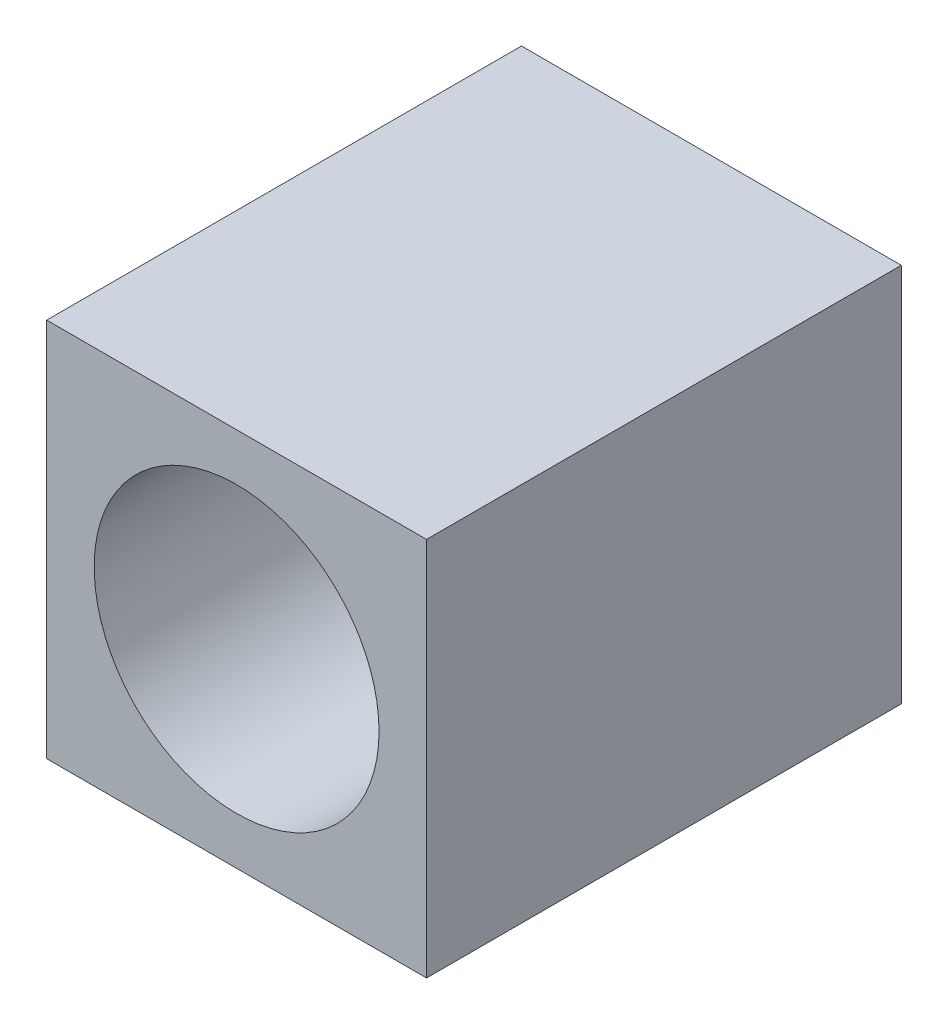
ISO-10303-21;
HEADER;
FILE_DESCRIPTION(('STEP AP214'),'2;1');
FILE_NAME('part.step','',(''),(''),'','','');
FILE_SCHEMA(('AUTOMOTIVE_DESIGN { 1 0 10303 214 1 1 1 1 }'));
ENDSEC;
DATA;
#1=APPLICATION_CONTEXT('core data for automotive mechanical design processes');
#2=APPLICATION_PROTOCOL_DEFINITION('international standard','automotive_design',2000,#1);
#3=PRODUCT_CONTEXT('',#1,'mechanical');
#4=PRODUCT('Part','Part','',(#3));
#5=PRODUCT_RELATED_PRODUCT_CATEGORY('part','',(#4));
#6=PRODUCT_DEFINITION_FORMATION('','',#4);
#7=PRODUCT_DEFINITION_CONTEXT('part definition',#1,'design');
#8=PRODUCT_DEFINITION('design','',#6,#7);
#9=PRODUCT_DEFINITION_SHAPE('','',#8);
#10=(LENGTH_UNIT() NAMED_UNIT(*) SI_UNIT(.MILLI.,.METRE.));
#11=(NAMED_UNIT(*) PLANE_ANGLE_UNIT() SI_UNIT($,.RADIAN.));
#12=(NAMED_UNIT(*) SI_UNIT($,.STERADIAN.) SOLID_ANGLE_UNIT());
#13=UNCERTAINTY_MEASURE_WITH_UNIT(LENGTH_MEASURE(1.E-05),#10,'distance_accuracy_value','');
#14=(GEOMETRIC_REPRESENTATION_CONTEXT(3) GLOBAL_UNCERTAINTY_ASSIGNED_CONTEXT((#13)) GLOBAL_UNIT_ASSIGNED_CONTEXT((#10,
#11,#12)) REPRESENTATION_CONTEXT('',''));
#15=CARTESIAN_POINT('',(0.,0.,0.));
#16=DIRECTION('',(0.,0.,1.));
#17=DIRECTION('',(1.,0.,0.));
#18=AXIS2_PLACEMENT_3D('',#15,#16,#17);
#19=CARTESIAN_POINT('',(0.,0.,50.));
#20=DIRECTION('',(0.,0.,-1.));
#21=DIRECTION('',(-1.,0.,0.));
#22=AXIS2_PLACEMENT_3D('',#19,#20,#21);
#23=PLANE('',#22);
#24=DIRECTION('',(0.,1.,0.));
#25=VECTOR('',#24,1.);
#26=CARTESIAN_POINT('',(19.9999999999999,-20.0000000000001,50.));
#27=LINE('',#26,#25);
#28=CARTESIAN_POINT('',(19.9999999999999,-20.0000000000001,50.));
#29=VERTEX_POINT('',#28);
#30=CARTESIAN_POINT('',(19.9999999999999,19.9999999999999,50.));
#31=VERTEX_POINT('',#30);
#32=EDGE_CURVE('E98',#29,#31,#27,.T.);
#33=ORIENTED_EDGE('',*,*,#32,.T.);
#34=DIRECTION('',(-1.,0.,0.));
#35=VECTOR('',#34,1.);
#36=CARTESIAN_POINT('',(-20.0000000000001,19.9999999999999,50.));
#37=LINE('',#36,#35);
#38=CARTESIAN_POINT('',(-20.0000000000001,19.9999999999999,50.));
#39=VERTEX_POINT('',#38);
#40=EDGE_CURVE('E93',#31,#39,#37,.T.);
#41=ORIENTED_EDGE('',*,*,#40,.T.);
#42=DIRECTION('',(0.,-1.,0.));
#43=VECTOR('',#42,1.);
#44=CARTESIAN_POINT('',(-20.0000000000001,-20.0000000000001,50.));
#45=LINE('',#44,#43);
#46=CARTESIAN_POINT('',(-20.0000000000001,-20.0000000000001,50.));
#47=VERTEX_POINT('',#46);
#48=EDGE_CURVE('E96',#39,#47,#45,.T.);
#49=ORIENTED_EDGE('',*,*,#48,.T.);
#50=DIRECTION('',(1.,0.,0.));
#51=VECTOR('',#50,1.);
#52=CARTESIAN_POINT('',(-20.0000000000001,-20.0000000000001,50.));
#53=LINE('',#52,#51);
#54=EDGE_CURVE('E63',#47,#29,#53,.T.);
#55=ORIENTED_EDGE('',*,*,#54,.T.);
#56=EDGE_LOOP('',(#33,#41,#49,#55));
#57=FACE_BOUND('',#56,.T.);
#58=CARTESIAN_POINT('',(0.,0.,50.));
#59=DIRECTION('',(0.,0.,1.));
#60=DIRECTION('',(1.,0.,0.));
#61=AXIS2_PLACEMENT_3D('',#58,#59,#60);
#62=CIRCLE('',#61,15.);
#63=CARTESIAN_POINT('',(15.,0.,50.));
#64=VERTEX_POINT('',#63);
#65=EDGE_CURVE('E118',#64,#64,#62,.T.);
#66=ORIENTED_EDGE('',*,*,#65,.F.);
#67=EDGE_LOOP('',(#66));
#68=FACE_BOUND('',#67,.T.);
#69=ADVANCED_FACE('F45',(#57,#68),#23,.F.);
#70=CARTESIAN_POINT('',(0.,0.,0.));
#71=DIRECTION('',(0.,0.,-1.));
#72=DIRECTION('',(-1.,0.,0.));
#73=AXIS2_PLACEMENT_3D('',#70,#71,#72);
#74=PLANE('',#73);
#75=DIRECTION('',(0.,1.,0.));
#76=VECTOR('',#75,1.);
#77=CARTESIAN_POINT('',(19.9999999999999,-20.0000000000001,0.));
#78=LINE('',#77,#76);
#79=CARTESIAN_POINT('',(19.9999999999999,-20.0000000000001,0.));
#80=VERTEX_POINT('',#79);
#81=CARTESIAN_POINT('',(19.9999999999999,19.9999999999999,0.));
#82=VERTEX_POINT('',#81);
#83=EDGE_CURVE('E114',#80,#82,#78,.T.);
#84=ORIENTED_EDGE('',*,*,#83,.F.);
#85=DIRECTION('',(1.,0.,0.));
#86=VECTOR('',#85,1.);
#87=CARTESIAN_POINT('',(-20.0000000000001,-20.0000000000001,0.));
#88=LINE('',#87,#86);
#89=CARTESIAN_POINT('',(-20.0000000000001,-20.0000000000001,0.));
#90=VERTEX_POINT('',#89);
#91=EDGE_CURVE('E86',#90,#80,#88,.T.);
#92=ORIENTED_EDGE('',*,*,#91,.F.);
#93=DIRECTION('',(0.,-1.,0.));
#94=VECTOR('',#93,1.);
#95=CARTESIAN_POINT('',(-20.0000000000001,-20.0000000000001,0.));
#96=LINE('',#95,#94);
#97=CARTESIAN_POINT('',(-20.0000000000001,19.9999999999999,0.));
#98=VERTEX_POINT('',#97);
#99=EDGE_CURVE('E80',#98,#90,#96,.T.);
#100=ORIENTED_EDGE('',*,*,#99,.F.);
#101=DIRECTION('',(-1.,0.,0.));
#102=VECTOR('',#101,1.);
#103=CARTESIAN_POINT('',(-20.0000000000001,19.9999999999999,0.));
#104=LINE('',#103,#102);
#105=EDGE_CURVE('E103',#82,#98,#104,.T.);
#106=ORIENTED_EDGE('',*,*,#105,.F.);
#107=EDGE_LOOP('',(#84,#92,#100,#106));
#108=FACE_BOUND('',#107,.T.);
#109=CARTESIAN_POINT('',(0.,0.,0.));
#110=DIRECTION('',(0.,0.,1.));
#111=DIRECTION('',(1.,0.,0.));
#112=AXIS2_PLACEMENT_3D('',#109,#110,#111);
#113=CIRCLE('',#112,15.);
#114=CARTESIAN_POINT('',(15.,0.,0.));
#115=VERTEX_POINT('',#114);
#116=EDGE_CURVE('E136',#115,#115,#113,.T.);
#117=ORIENTED_EDGE('',*,*,#116,.T.);
#118=EDGE_LOOP('',(#117));
#119=FACE_BOUND('',#118,.T.);
#120=ADVANCED_FACE('F131',(#108,#119),#74,.T.);
#121=CARTESIAN_POINT('',(19.9999999999999,-20.0000000000001,50.));
#122=DIRECTION('',(-1.,0.,0.));
#123=DIRECTION('',(0.,0.,1.));
#124=AXIS2_PLACEMENT_3D('',#121,#122,#123);
#125=PLANE('',#124);
#126=ORIENTED_EDGE('',*,*,#83,.T.);
#127=DIRECTION('',(0.,0.,-1.));
#128=VECTOR('',#127,1.);
#129=CARTESIAN_POINT('',(19.9999999999999,19.9999999999999,50.));
#130=LINE('',#129,#128);
#131=EDGE_CURVE('E11',#31,#82,#130,.T.);
#132=ORIENTED_EDGE('',*,*,#131,.F.);
#133=ORIENTED_EDGE('',*,*,#32,.F.);
#134=DIRECTION('',(0.,0.,-1.));
#135=VECTOR('',#134,1.);
#136=CARTESIAN_POINT('',(19.9999999999999,-20.0000000000001,50.));
#137=LINE('',#136,#135);
#138=EDGE_CURVE('E110',#29,#80,#137,.T.);
#139=ORIENTED_EDGE('',*,*,#138,.T.);
#140=EDGE_LOOP('',(#126,#132,#133,#139));
#141=FACE_BOUND('',#140,.T.);
#142=ADVANCED_FACE('F47',(#141),#125,.F.);
#143=CARTESIAN_POINT('',(-20.0000000000001,19.9999999999999,50.));
#144=DIRECTION('',(0.,-1.,0.));
#145=DIRECTION('',(0.,0.,-1.));
#146=AXIS2_PLACEMENT_3D('',#143,#144,#145);
#147=PLANE('',#146);
#148=ORIENTED_EDGE('',*,*,#105,.T.);
#149=DIRECTION('',(0.,0.,-1.));
#150=VECTOR('',#149,1.);
#151=CARTESIAN_POINT('',(-20.0000000000001,19.9999999999999,50.));
#152=LINE('',#151,#150);
#153=EDGE_CURVE('E55',#39,#98,#152,.T.);
#154=ORIENTED_EDGE('',*,*,#153,.F.);
#155=ORIENTED_EDGE('',*,*,#40,.F.);
#156=ORIENTED_EDGE('',*,*,#131,.T.);
#157=EDGE_LOOP('',(#148,#154,#155,#156));
#158=FACE_BOUND('',#157,.T.);
#159=ADVANCED_FACE('F102',(#158),#147,.F.);
#160=CARTESIAN_POINT('',(-20.0000000000001,-20.0000000000001,50.));
#161=DIRECTION('',(1.,0.,0.));
#162=DIRECTION('',(0.,0.,-1.));
#163=AXIS2_PLACEMENT_3D('',#160,#161,#162);
#164=PLANE('',#163);
#165=ORIENTED_EDGE('',*,*,#99,.T.);
#166=DIRECTION('',(0.,0.,-1.));
#167=VECTOR('',#166,1.);
#168=CARTESIAN_POINT('',(-20.0000000000001,-20.0000000000001,50.));
#169=LINE('',#168,#167);
#170=EDGE_CURVE('E105',#47,#90,#169,.T.);
#171=ORIENTED_EDGE('',*,*,#170,.F.);
#172=ORIENTED_EDGE('',*,*,#48,.F.);
#173=ORIENTED_EDGE('',*,*,#153,.T.);
#174=EDGE_LOOP('',(#165,#171,#172,#173));
#175=FACE_BOUND('',#174,.T.);
#176=ADVANCED_FACE('F106',(#175),#164,.F.);
#177=CARTESIAN_POINT('',(-20.0000000000001,-20.0000000000001,50.));
#178=DIRECTION('',(0.,1.,0.));
#179=DIRECTION('',(0.,0.,1.));
#180=AXIS2_PLACEMENT_3D('',#177,#178,#179);
#181=PLANE('',#180);
#182=ORIENTED_EDGE('',*,*,#91,.T.);
#183=ORIENTED_EDGE('',*,*,#138,.F.);
#184=ORIENTED_EDGE('',*,*,#54,.F.);
#185=ORIENTED_EDGE('',*,*,#170,.T.);
#186=EDGE_LOOP('',(#182,#183,#184,#185));
#187=FACE_BOUND('',#186,.T.);
#188=ADVANCED_FACE('F128',(#187),#181,.F.);
#189=CARTESIAN_POINT('',(0.,0.,50.));
#190=DIRECTION('',(0.,0.,-1.));
#191=DIRECTION('',(-1.,0.,0.));
#192=AXIS2_PLACEMENT_3D('',#189,#190,#191);
#193=CYLINDRICAL_SURFACE('',#192,15.);
#194=ORIENTED_EDGE('',*,*,#65,.T.);
#195=EDGE_LOOP('',(#194));
#196=FACE_BOUND('',#195,.T.);
#197=ORIENTED_EDGE('',*,*,#116,.F.);
#198=EDGE_LOOP('',(#197));
#199=FACE_BOUND('',#198,.T.);
#200=ADVANCED_FACE('F144',(#196,#199),#193,.F.);
#201=CLOSED_SHELL('',(#69,#120,#142,#159,#176,#188,#200));
#202=MANIFOLD_SOLID_BREP('B2',#201);
#203=ADVANCED_BREP_SHAPE_REPRESENTATION('',(#18,#202),#14);
#204=SHAPE_DEFINITION_REPRESENTATION(#9,#203);
ENDSEC;
END-ISO-10303-21;
